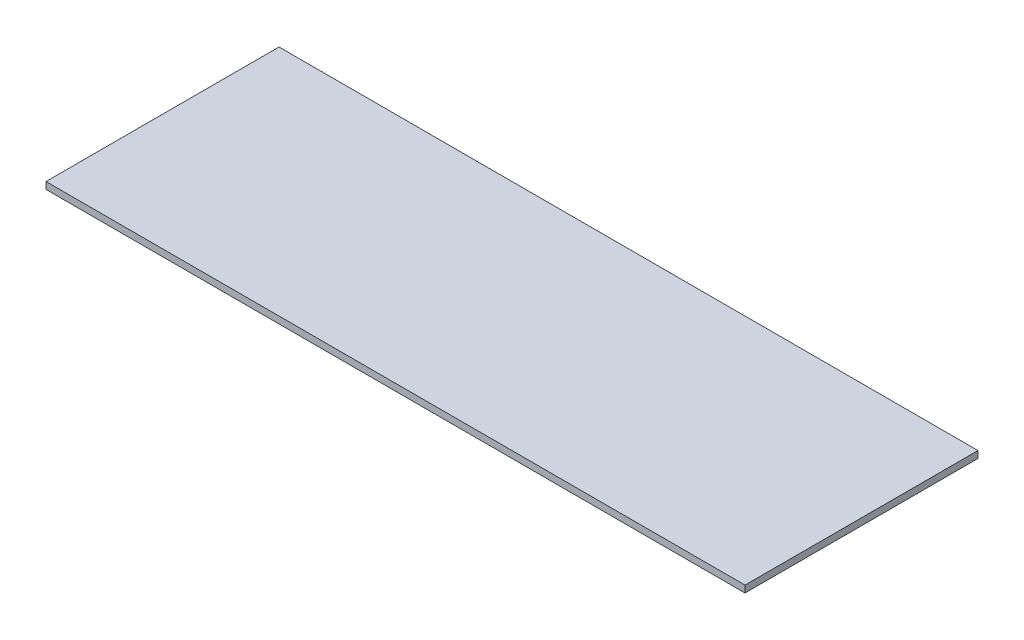
ISO-10303-21;
HEADER;
FILE_DESCRIPTION(('STEP AP214'),'2;1');
FILE_NAME('part.step','',(''),(''),'','','');
FILE_SCHEMA(('AUTOMOTIVE_DESIGN { 1 0 10303 214 1 1 1 1 }'));
ENDSEC;
DATA;
#1=APPLICATION_CONTEXT('core data for automotive mechanical design processes');
#2=APPLICATION_PROTOCOL_DEFINITION('international standard','automotive_design',2000,#1);
#3=PRODUCT_CONTEXT('',#1,'mechanical');
#4=PRODUCT('Part','Part','',(#3));
#5=PRODUCT_RELATED_PRODUCT_CATEGORY('part','',(#4));
#6=PRODUCT_DEFINITION_FORMATION('','',#4);
#7=PRODUCT_DEFINITION_CONTEXT('part definition',#1,'design');
#8=PRODUCT_DEFINITION('design','',#6,#7);
#9=PRODUCT_DEFINITION_SHAPE('','',#8);
#10=(LENGTH_UNIT() NAMED_UNIT(*) SI_UNIT(.MILLI.,.METRE.));
#11=(NAMED_UNIT(*) PLANE_ANGLE_UNIT() SI_UNIT($,.RADIAN.));
#12=(NAMED_UNIT(*) SI_UNIT($,.STERADIAN.) SOLID_ANGLE_UNIT());
#13=UNCERTAINTY_MEASURE_WITH_UNIT(LENGTH_MEASURE(1.E-05),#10,'distance_accuracy_value','');
#14=(GEOMETRIC_REPRESENTATION_CONTEXT(3) GLOBAL_UNCERTAINTY_ASSIGNED_CONTEXT((#13)) GLOBAL_UNIT_ASSIGNED_CONTEXT((#10,
#11,#12)) REPRESENTATION_CONTEXT('',''));
#15=CARTESIAN_POINT('',(0.,0.,0.));
#16=DIRECTION('',(0.,0.,1.));
#17=DIRECTION('',(1.,0.,0.));
#18=AXIS2_PLACEMENT_3D('',#15,#16,#17);
#19=CARTESIAN_POINT('',(-304.8,6.,101.6));
#20=DIRECTION('',(1.,0.,0.));
#21=DIRECTION('',(0.,0.,-1.));
#22=AXIS2_PLACEMENT_3D('',#19,#20,#21);
#23=PLANE('',#22);
#24=DIRECTION('',(0.,0.,1.));
#25=VECTOR('',#24,1.);
#26=CARTESIAN_POINT('',(-304.8,0.,101.6));
#27=LINE('',#26,#25);
#28=CARTESIAN_POINT('',(-304.8,0.,-101.6));
#29=VERTEX_POINT('',#28);
#30=CARTESIAN_POINT('',(-304.8,0.,101.6));
#31=VERTEX_POINT('',#30);
#32=EDGE_CURVE('E98',#29,#31,#27,.T.);
#33=ORIENTED_EDGE('',*,*,#32,.T.);
#34=DIRECTION('',(0.,-1.,0.));
#35=VECTOR('',#34,1.);
#36=CARTESIAN_POINT('',(-304.8,6.,101.6));
#37=LINE('',#36,#35);
#38=CARTESIAN_POINT('',(-304.8,6.,101.6));
#39=VERTEX_POINT('',#38);
#40=EDGE_CURVE('E11',#39,#31,#37,.T.);
#41=ORIENTED_EDGE('',*,*,#40,.F.);
#42=DIRECTION('',(0.,0.,1.));
#43=VECTOR('',#42,1.);
#44=CARTESIAN_POINT('',(-304.8,6.,101.6));
#45=LINE('',#44,#43);
#46=CARTESIAN_POINT('',(-304.8,6.,-101.6));
#47=VERTEX_POINT('',#46);
#48=EDGE_CURVE('E86',#47,#39,#45,.T.);
#49=ORIENTED_EDGE('',*,*,#48,.F.);
#50=DIRECTION('',(0.,-1.,0.));
#51=VECTOR('',#50,1.);
#52=CARTESIAN_POINT('',(-304.8,6.,-101.6));
#53=LINE('',#52,#51);
#54=EDGE_CURVE('E94',#47,#29,#53,.T.);
#55=ORIENTED_EDGE('',*,*,#54,.T.);
#56=EDGE_LOOP('',(#33,#41,#49,#55));
#57=FACE_BOUND('',#56,.T.);
#58=ADVANCED_FACE('F35',(#57),#23,.F.);
#59=CARTESIAN_POINT('',(304.8,6.,101.6));
#60=DIRECTION('',(0.,0.,-1.));
#61=DIRECTION('',(-1.,0.,0.));
#62=AXIS2_PLACEMENT_3D('',#59,#60,#61);
#63=PLANE('',#62);
#64=DIRECTION('',(1.,0.,0.));
#65=VECTOR('',#64,1.);
#66=CARTESIAN_POINT('',(304.8,0.,101.6));
#67=LINE('',#66,#65);
#68=CARTESIAN_POINT('',(304.8,0.,101.6));
#69=VERTEX_POINT('',#68);
#70=EDGE_CURVE('E90',#31,#69,#67,.T.);
#71=ORIENTED_EDGE('',*,*,#70,.T.);
#72=DIRECTION('',(0.,-1.,0.));
#73=VECTOR('',#72,1.);
#74=CARTESIAN_POINT('',(304.8,6.,101.6));
#75=LINE('',#74,#73);
#76=CARTESIAN_POINT('',(304.8,6.,101.6));
#77=VERTEX_POINT('',#76);
#78=EDGE_CURVE('E43',#77,#69,#75,.T.);
#79=ORIENTED_EDGE('',*,*,#78,.F.);
#80=DIRECTION('',(1.,0.,0.));
#81=VECTOR('',#80,1.);
#82=CARTESIAN_POINT('',(304.8,6.,101.6));
#83=LINE('',#82,#81);
#84=EDGE_CURVE('E81',#39,#77,#83,.T.);
#85=ORIENTED_EDGE('',*,*,#84,.F.);
#86=ORIENTED_EDGE('',*,*,#40,.T.);
#87=EDGE_LOOP('',(#71,#79,#85,#86));
#88=FACE_BOUND('',#87,.T.);
#89=ADVANCED_FACE('F89',(#88),#63,.F.);
#90=CARTESIAN_POINT('',(304.8,6.,101.6));
#91=DIRECTION('',(-1.,0.,0.));
#92=DIRECTION('',(0.,0.,1.));
#93=AXIS2_PLACEMENT_3D('',#90,#91,#92);
#94=PLANE('',#93);
#95=DIRECTION('',(0.,0.,-1.));
#96=VECTOR('',#95,1.);
#97=CARTESIAN_POINT('',(304.8,0.,101.6));
#98=LINE('',#97,#96);
#99=CARTESIAN_POINT('',(304.8,0.,-101.6));
#100=VERTEX_POINT('',#99);
#101=EDGE_CURVE('E68',#69,#100,#98,.T.);
#102=ORIENTED_EDGE('',*,*,#101,.T.);
#103=DIRECTION('',(0.,-1.,0.));
#104=VECTOR('',#103,1.);
#105=CARTESIAN_POINT('',(304.8,6.,-101.6));
#106=LINE('',#105,#104);
#107=CARTESIAN_POINT('',(304.8,6.,-101.6));
#108=VERTEX_POINT('',#107);
#109=EDGE_CURVE('E91',#108,#100,#106,.T.);
#110=ORIENTED_EDGE('',*,*,#109,.F.);
#111=DIRECTION('',(0.,0.,-1.));
#112=VECTOR('',#111,1.);
#113=CARTESIAN_POINT('',(304.8,6.,101.6));
#114=LINE('',#113,#112);
#115=EDGE_CURVE('E84',#77,#108,#114,.T.);
#116=ORIENTED_EDGE('',*,*,#115,.F.);
#117=ORIENTED_EDGE('',*,*,#78,.T.);
#118=EDGE_LOOP('',(#102,#110,#116,#117));
#119=FACE_BOUND('',#118,.T.);
#120=ADVANCED_FACE('F92',(#119),#94,.F.);
#121=CARTESIAN_POINT('',(304.8,6.,-101.6));
#122=DIRECTION('',(0.,0.,1.));
#123=DIRECTION('',(1.,0.,0.));
#124=AXIS2_PLACEMENT_3D('',#121,#122,#123);
#125=PLANE('',#124);
#126=DIRECTION('',(-1.,0.,0.));
#127=VECTOR('',#126,1.);
#128=CARTESIAN_POINT('',(304.8,0.,-101.6));
#129=LINE('',#128,#127);
#130=EDGE_CURVE('E74',#100,#29,#129,.T.);
#131=ORIENTED_EDGE('',*,*,#130,.T.);
#132=ORIENTED_EDGE('',*,*,#54,.F.);
#133=DIRECTION('',(-1.,0.,0.));
#134=VECTOR('',#133,1.);
#135=CARTESIAN_POINT('',(304.8,6.,-101.6));
#136=LINE('',#135,#134);
#137=EDGE_CURVE('E51',#108,#47,#136,.T.);
#138=ORIENTED_EDGE('',*,*,#137,.F.);
#139=ORIENTED_EDGE('',*,*,#109,.T.);
#140=EDGE_LOOP('',(#131,#132,#138,#139));
#141=FACE_BOUND('',#140,.T.);
#142=ADVANCED_FACE('F105',(#141),#125,.F.);
#143=CARTESIAN_POINT('',(0.,6.,0.));
#144=DIRECTION('',(0.,1.,0.));
#145=DIRECTION('',(0.,0.,1.));
#146=AXIS2_PLACEMENT_3D('',#143,#144,#145);
#147=PLANE('',#146);
#148=ORIENTED_EDGE('',*,*,#48,.T.);
#149=ORIENTED_EDGE('',*,*,#84,.T.);
#150=ORIENTED_EDGE('',*,*,#115,.T.);
#151=ORIENTED_EDGE('',*,*,#137,.T.);
#152=EDGE_LOOP('',(#148,#149,#150,#151));
#153=FACE_BOUND('',#152,.T.);
#154=ADVANCED_FACE('F82',(#153),#147,.T.);
#155=CARTESIAN_POINT('',(0.,0.,0.));
#156=DIRECTION('',(0.,1.,0.));
#157=DIRECTION('',(0.,0.,1.));
#158=AXIS2_PLACEMENT_3D('',#155,#156,#157);
#159=PLANE('',#158);
#160=ORIENTED_EDGE('',*,*,#32,.F.);
#161=ORIENTED_EDGE('',*,*,#130,.F.);
#162=ORIENTED_EDGE('',*,*,#101,.F.);
#163=ORIENTED_EDGE('',*,*,#70,.F.);
#164=EDGE_LOOP('',(#160,#161,#162,#163));
#165=FACE_BOUND('',#164,.T.);
#166=ADVANCED_FACE('F108',(#165),#159,.F.);
#167=CLOSED_SHELL('',(#58,#89,#120,#142,#154,#166));
#168=MANIFOLD_SOLID_BREP('B2',#167);
#169=ADVANCED_BREP_SHAPE_REPRESENTATION('',(#18,#168),#14);
#170=SHAPE_DEFINITION_REPRESENTATION(#9,#169);
ENDSEC;
END-ISO-10303-21;
